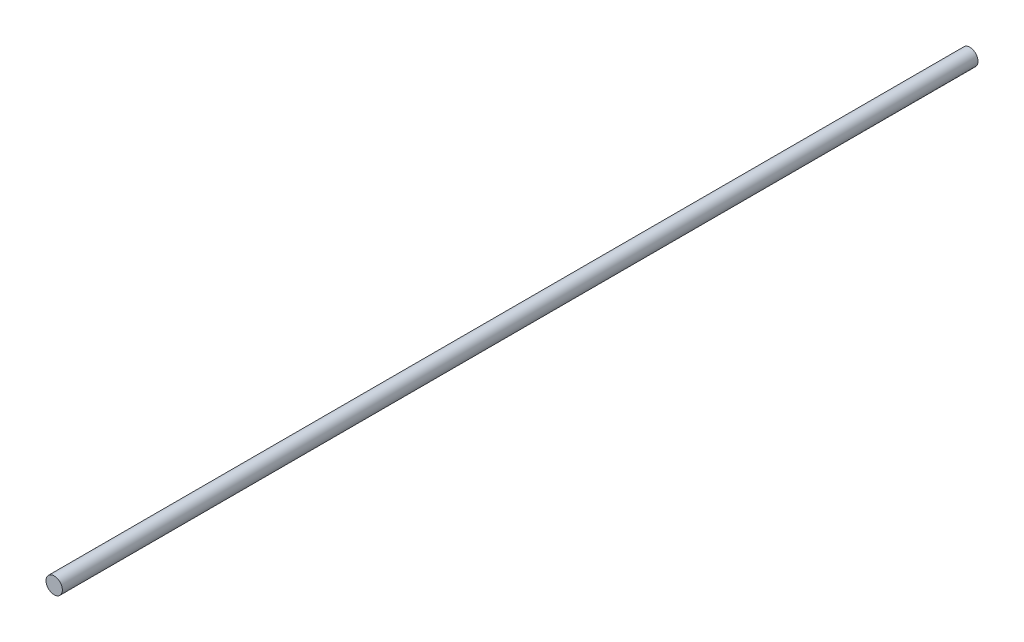
ISO-10303-21;
HEADER;
FILE_DESCRIPTION(('STEP AP214'),'2;1');
FILE_NAME('part.step','',(''),(''),'','','');
FILE_SCHEMA(('AUTOMOTIVE_DESIGN { 1 0 10303 214 1 1 1 1 }'));
ENDSEC;
DATA;
#1=APPLICATION_CONTEXT('core data for automotive mechanical design processes');
#2=APPLICATION_PROTOCOL_DEFINITION('international standard','automotive_design',2000,#1);
#3=PRODUCT_CONTEXT('',#1,'mechanical');
#4=PRODUCT('Part','Part','',(#3));
#5=PRODUCT_RELATED_PRODUCT_CATEGORY('part','',(#4));
#6=PRODUCT_DEFINITION_FORMATION('','',#4);
#7=PRODUCT_DEFINITION_CONTEXT('part definition',#1,'design');
#8=PRODUCT_DEFINITION('design','',#6,#7);
#9=PRODUCT_DEFINITION_SHAPE('','',#8);
#10=(LENGTH_UNIT() NAMED_UNIT(*) SI_UNIT(.MILLI.,.METRE.));
#11=(NAMED_UNIT(*) PLANE_ANGLE_UNIT() SI_UNIT($,.RADIAN.));
#12=(NAMED_UNIT(*) SI_UNIT($,.STERADIAN.) SOLID_ANGLE_UNIT());
#13=UNCERTAINTY_MEASURE_WITH_UNIT(LENGTH_MEASURE(1.E-05),#10,'distance_accuracy_value','');
#14=(GEOMETRIC_REPRESENTATION_CONTEXT(3) GLOBAL_UNCERTAINTY_ASSIGNED_CONTEXT((#13)) GLOBAL_UNIT_ASSIGNED_CONTEXT((#10,
#11,#12)) REPRESENTATION_CONTEXT('',''));
#15=CARTESIAN_POINT('',(0.,0.,0.));
#16=DIRECTION('',(0.,0.,1.));
#17=DIRECTION('',(1.,0.,0.));
#18=AXIS2_PLACEMENT_3D('',#15,#16,#17);
#19=CARTESIAN_POINT('',(0.,0.,280.));
#20=DIRECTION('',(0.,0.,-1.));
#21=DIRECTION('',(-1.,0.,0.));
#22=AXIS2_PLACEMENT_3D('',#19,#20,#21);
#23=CYLINDRICAL_SURFACE('',#22,2.5);
#24=CARTESIAN_POINT('',(0.,0.,280.));
#25=DIRECTION('',(0.,0.,1.));
#26=DIRECTION('',(1.,0.,0.));
#27=AXIS2_PLACEMENT_3D('',#24,#25,#26);
#28=CIRCLE('',#27,2.5);
#29=CARTESIAN_POINT('',(2.5,0.,280.));
#30=VERTEX_POINT('',#29);
#31=EDGE_CURVE('E10',#30,#30,#28,.T.);
#32=ORIENTED_EDGE('',*,*,#31,.F.);
#33=EDGE_LOOP('',(#32));
#34=FACE_BOUND('',#33,.T.);
#35=CARTESIAN_POINT('',(0.,0.,0.));
#36=DIRECTION('',(0.,0.,1.));
#37=DIRECTION('',(1.,0.,0.));
#38=AXIS2_PLACEMENT_3D('',#35,#36,#37);
#39=CIRCLE('',#38,2.5);
#40=CARTESIAN_POINT('',(2.5,0.,0.));
#41=VERTEX_POINT('',#40);
#42=EDGE_CURVE('E34',#41,#41,#39,.T.);
#43=ORIENTED_EDGE('',*,*,#42,.T.);
#44=EDGE_LOOP('',(#43));
#45=FACE_BOUND('',#44,.T.);
#46=ADVANCED_FACE('F31',(#34,#45),#23,.T.);
#47=CARTESIAN_POINT('',(0.,0.,280.));
#48=DIRECTION('',(0.,0.,1.));
#49=DIRECTION('',(1.,0.,0.));
#50=AXIS2_PLACEMENT_3D('',#47,#48,#49);
#51=PLANE('',#50);
#52=ORIENTED_EDGE('',*,*,#31,.T.);
#53=EDGE_LOOP('',(#52));
#54=FACE_BOUND('',#53,.T.);
#55=ADVANCED_FACE('F46',(#54),#51,.T.);
#56=CARTESIAN_POINT('',(0.,0.,0.));
#57=DIRECTION('',(0.,0.,1.));
#58=DIRECTION('',(1.,0.,0.));
#59=AXIS2_PLACEMENT_3D('',#56,#57,#58);
#60=PLANE('',#59);
#61=ORIENTED_EDGE('',*,*,#42,.F.);
#62=EDGE_LOOP('',(#61));
#63=FACE_BOUND('',#62,.T.);
#64=ADVANCED_FACE('F44',(#63),#60,.F.);
#65=CLOSED_SHELL('',(#46,#55,#64));
#66=MANIFOLD_SOLID_BREP('B2',#65);
#67=ADVANCED_BREP_SHAPE_REPRESENTATION('',(#18,#66),#14);
#68=SHAPE_DEFINITION_REPRESENTATION(#9,#67);
ENDSEC;
END-ISO-10303-21;
